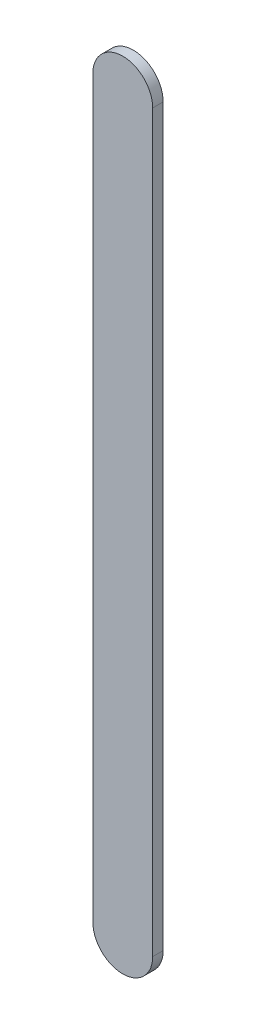
ISO-10303-21;
HEADER;
FILE_DESCRIPTION(('STEP AP214'),'2;1');
FILE_NAME('part.step','',(''),(''),'','','');
FILE_SCHEMA(('AUTOMOTIVE_DESIGN { 1 0 10303 214 1 1 1 1 }'));
ENDSEC;
DATA;
#1=APPLICATION_CONTEXT('core data for automotive mechanical design processes');
#2=APPLICATION_PROTOCOL_DEFINITION('international standard','automotive_design',2000,#1);
#3=PRODUCT_CONTEXT('',#1,'mechanical');
#4=PRODUCT('Part','Part','',(#3));
#5=PRODUCT_RELATED_PRODUCT_CATEGORY('part','',(#4));
#6=PRODUCT_DEFINITION_FORMATION('','',#4);
#7=PRODUCT_DEFINITION_CONTEXT('part definition',#1,'design');
#8=PRODUCT_DEFINITION('design','',#6,#7);
#9=PRODUCT_DEFINITION_SHAPE('','',#8);
#10=(LENGTH_UNIT() NAMED_UNIT(*) SI_UNIT(.MILLI.,.METRE.));
#11=(NAMED_UNIT(*) PLANE_ANGLE_UNIT() SI_UNIT($,.RADIAN.));
#12=(NAMED_UNIT(*) SI_UNIT($,.STERADIAN.) SOLID_ANGLE_UNIT());
#13=UNCERTAINTY_MEASURE_WITH_UNIT(LENGTH_MEASURE(1.E-05),#10,'distance_accuracy_value','');
#14=(GEOMETRIC_REPRESENTATION_CONTEXT(3) GLOBAL_UNCERTAINTY_ASSIGNED_CONTEXT((#13)) GLOBAL_UNIT_ASSIGNED_CONTEXT((#10,
#11,#12)) REPRESENTATION_CONTEXT('',''));
#15=CARTESIAN_POINT('',(0.,0.,0.));
#16=DIRECTION('',(0.,0.,1.));
#17=DIRECTION('',(1.,0.,0.));
#18=AXIS2_PLACEMENT_3D('',#15,#16,#17);
#19=CARTESIAN_POINT('',(82.85,-123.683866,1.635));
#20=DIRECTION('',(0.,0.,1.));
#21=DIRECTION('',(1.,0.,0.));
#22=AXIS2_PLACEMENT_3D('',#19,#20,#21);
#23=PLANE('',#22);
#24=DIRECTION('',(0.,-1.,0.));
#25=VECTOR('',#24,1.);
#26=CARTESIAN_POINT('',(82.85,-123.683866,1.635));
#27=LINE('',#26,#25);
#28=CARTESIAN_POINT('',(82.85,-123.683866,1.635));
#29=VERTEX_POINT('',#28);
#30=CARTESIAN_POINT('',(82.85,-126.14,1.635));
#31=VERTEX_POINT('',#30);
#32=EDGE_CURVE('E80',#29,#31,#27,.T.);
#33=ORIENTED_EDGE('',*,*,#32,.T.);
#34=CARTESIAN_POINT('',(82.95,-126.14,1.635));
#35=DIRECTION('',(0.,0.,1.));
#36=DIRECTION('',(-1.,0.,0.));
#37=AXIS2_PLACEMENT_3D('',#34,#35,#36);
#38=CIRCLE('',#37,0.1);
#39=CARTESIAN_POINT('',(83.05,-126.14,1.635));
#40=VERTEX_POINT('',#39);
#41=EDGE_CURVE('E78',#31,#40,#38,.T.);
#42=ORIENTED_EDGE('',*,*,#41,.T.);
#43=DIRECTION('',(0.,1.,0.));
#44=VECTOR('',#43,1.);
#45=CARTESIAN_POINT('',(83.05,-126.14,1.635));
#46=LINE('',#45,#44);
#47=CARTESIAN_POINT('',(83.05,-123.683866,1.635));
#48=VERTEX_POINT('',#47);
#49=EDGE_CURVE('E21',#40,#48,#46,.T.);
#50=ORIENTED_EDGE('',*,*,#49,.T.);
#51=CARTESIAN_POINT('',(82.95,-123.683866,1.635));
#52=DIRECTION('',(0.,0.,1.));
#53=DIRECTION('',(1.,0.,0.));
#54=AXIS2_PLACEMENT_3D('',#51,#52,#53);
#55=CIRCLE('',#54,0.1);
#56=EDGE_CURVE('E11',#48,#29,#55,.T.);
#57=ORIENTED_EDGE('',*,*,#56,.T.);
#58=EDGE_LOOP('',(#33,#42,#50,#57));
#59=FACE_BOUND('',#58,.T.);
#60=ADVANCED_FACE('F17',(#59),#23,.T.);
#61=CARTESIAN_POINT('',(82.85,-123.683866,1.6));
#62=DIRECTION('',(0.,0.,1.));
#63=DIRECTION('',(1.,0.,0.));
#64=AXIS2_PLACEMENT_3D('',#61,#62,#63);
#65=PLANE('',#64);
#66=CARTESIAN_POINT('',(82.95,-123.683866,1.6));
#67=DIRECTION('',(0.,0.,1.));
#68=DIRECTION('',(1.,0.,0.));
#69=AXIS2_PLACEMENT_3D('',#66,#67,#68);
#70=CIRCLE('',#69,0.1);
#71=CARTESIAN_POINT('',(83.05,-123.683866,1.6));
#72=VERTEX_POINT('',#71);
#73=CARTESIAN_POINT('',(82.85,-123.683866,1.6));
#74=VERTEX_POINT('',#73);
#75=EDGE_CURVE('E28',#72,#74,#70,.T.);
#76=ORIENTED_EDGE('',*,*,#75,.F.);
#77=DIRECTION('',(0.,1.,0.));
#78=VECTOR('',#77,1.);
#79=CARTESIAN_POINT('',(83.05,-126.14,1.6));
#80=LINE('',#79,#78);
#81=CARTESIAN_POINT('',(83.05,-126.14,1.6));
#82=VERTEX_POINT('',#81);
#83=EDGE_CURVE('E85',#82,#72,#80,.T.);
#84=ORIENTED_EDGE('',*,*,#83,.F.);
#85=CARTESIAN_POINT('',(82.95,-126.14,1.6));
#86=DIRECTION('',(0.,0.,1.));
#87=DIRECTION('',(-1.,0.,0.));
#88=AXIS2_PLACEMENT_3D('',#85,#86,#87);
#89=CIRCLE('',#88,0.1);
#90=CARTESIAN_POINT('',(82.85,-126.14,1.6));
#91=VERTEX_POINT('',#90);
#92=EDGE_CURVE('E87',#91,#82,#89,.T.);
#93=ORIENTED_EDGE('',*,*,#92,.F.);
#94=DIRECTION('',(0.,-1.,0.));
#95=VECTOR('',#94,1.);
#96=CARTESIAN_POINT('',(82.85,-123.683866,1.6));
#97=LINE('',#96,#95);
#98=EDGE_CURVE('E137',#74,#91,#97,.T.);
#99=ORIENTED_EDGE('',*,*,#98,.F.);
#100=EDGE_LOOP('',(#76,#84,#93,#99));
#101=FACE_BOUND('',#100,.T.);
#102=ADVANCED_FACE('F182',(#101),#65,.F.);
#103=CARTESIAN_POINT('',(82.95,-123.683866,1.6));
#104=DIRECTION('',(0.,0.,-1.));
#105=DIRECTION('',(1.,0.,0.));
#106=AXIS2_PLACEMENT_3D('',#103,#104,#105);
#107=CYLINDRICAL_SURFACE('',#106,0.1);
#108=ORIENTED_EDGE('',*,*,#75,.T.);
#109=DIRECTION('',(0.,0.,1.));
#110=VECTOR('',#109,1.);
#111=CARTESIAN_POINT('',(82.85,-123.683866,1.6));
#112=LINE('',#111,#110);
#113=EDGE_CURVE('E94',#74,#29,#112,.T.);
#114=ORIENTED_EDGE('',*,*,#113,.T.);
#115=ORIENTED_EDGE('',*,*,#56,.F.);
#116=DIRECTION('',(0.,0.,1.));
#117=VECTOR('',#116,1.);
#118=CARTESIAN_POINT('',(83.05,-123.683866,1.6));
#119=LINE('',#118,#117);
#120=EDGE_CURVE('E74',#72,#48,#119,.T.);
#121=ORIENTED_EDGE('',*,*,#120,.F.);
#122=EDGE_LOOP('',(#108,#114,#115,#121));
#123=FACE_BOUND('',#122,.T.);
#124=ADVANCED_FACE('F173',(#123),#107,.T.);
#125=CARTESIAN_POINT('',(83.05,-126.14,1.6));
#126=DIRECTION('',(-1.,0.,0.));
#127=DIRECTION('',(0.,0.,1.));
#128=AXIS2_PLACEMENT_3D('',#125,#126,#127);
#129=PLANE('',#128);
#130=ORIENTED_EDGE('',*,*,#83,.T.);
#131=ORIENTED_EDGE('',*,*,#120,.T.);
#132=ORIENTED_EDGE('',*,*,#49,.F.);
#133=DIRECTION('',(0.,0.,1.));
#134=VECTOR('',#133,1.);
#135=CARTESIAN_POINT('',(83.05,-126.14,1.6));
#136=LINE('',#135,#134);
#137=EDGE_CURVE('E72',#82,#40,#136,.T.);
#138=ORIENTED_EDGE('',*,*,#137,.F.);
#139=EDGE_LOOP('',(#130,#131,#132,#138));
#140=FACE_BOUND('',#139,.T.);
#141=ADVANCED_FACE('F70',(#140),#129,.F.);
#142=CARTESIAN_POINT('',(82.95,-126.14,1.6));
#143=DIRECTION('',(0.,0.,-1.));
#144=DIRECTION('',(-1.,0.,0.));
#145=AXIS2_PLACEMENT_3D('',#142,#143,#144);
#146=CYLINDRICAL_SURFACE('',#145,0.1);
#147=ORIENTED_EDGE('',*,*,#92,.T.);
#148=ORIENTED_EDGE('',*,*,#137,.T.);
#149=ORIENTED_EDGE('',*,*,#41,.F.);
#150=DIRECTION('',(0.,0.,1.));
#151=VECTOR('',#150,1.);
#152=CARTESIAN_POINT('',(82.85,-126.14,1.6));
#153=LINE('',#152,#151);
#154=EDGE_CURVE('E131',#91,#31,#153,.T.);
#155=ORIENTED_EDGE('',*,*,#154,.F.);
#156=EDGE_LOOP('',(#147,#148,#149,#155));
#157=FACE_BOUND('',#156,.T.);
#158=ADVANCED_FACE('F19',(#157),#146,.T.);
#159=CARTESIAN_POINT('',(82.85,-123.683866,1.6));
#160=DIRECTION('',(1.,0.,0.));
#161=DIRECTION('',(0.,1.,0.));
#162=AXIS2_PLACEMENT_3D('',#159,#160,#161);
#163=PLANE('',#162);
#164=ORIENTED_EDGE('',*,*,#98,.T.);
#165=ORIENTED_EDGE('',*,*,#154,.T.);
#166=ORIENTED_EDGE('',*,*,#32,.F.);
#167=ORIENTED_EDGE('',*,*,#113,.F.);
#168=EDGE_LOOP('',(#164,#165,#166,#167));
#169=FACE_BOUND('',#168,.T.);
#170=ADVANCED_FACE('F149',(#169),#163,.F.);
#171=CLOSED_SHELL('',(#60,#102,#124,#141,#158,#170));
#172=MANIFOLD_SOLID_BREP('B1',#171);
#173=ADVANCED_BREP_SHAPE_REPRESENTATION('',(#18,#172),#14);
#174=SHAPE_DEFINITION_REPRESENTATION(#9,#173);
ENDSEC;
END-ISO-10303-21;
